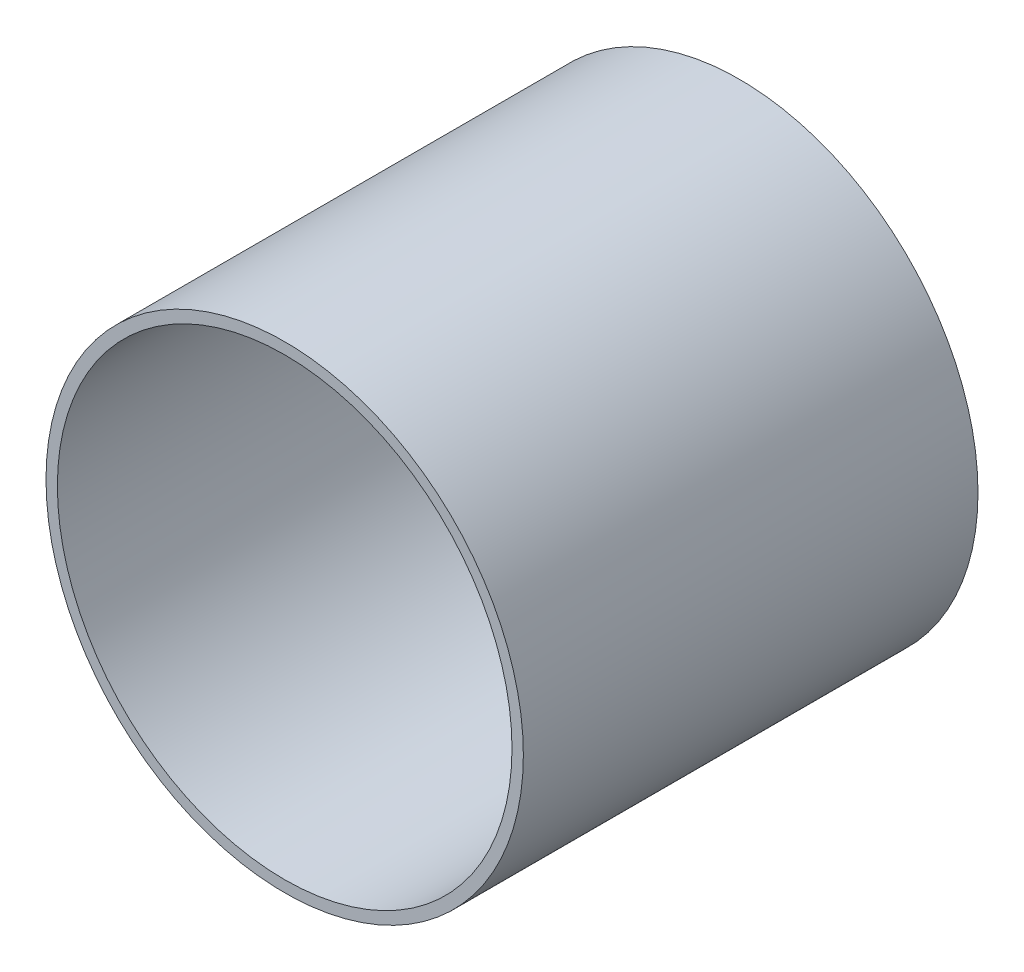
ISO-10303-21;
HEADER;
FILE_DESCRIPTION(('STEP AP214'),'2;1');
FILE_NAME('part.step','',(''),(''),'','','');
FILE_SCHEMA(('AUTOMOTIVE_DESIGN { 1 0 10303 214 1 1 1 1 }'));
ENDSEC;
DATA;
#1=APPLICATION_CONTEXT('core data for automotive mechanical design processes');
#2=APPLICATION_PROTOCOL_DEFINITION('international standard','automotive_design',2000,#1);
#3=PRODUCT_CONTEXT('',#1,'mechanical');
#4=PRODUCT('Part','Part','',(#3));
#5=PRODUCT_RELATED_PRODUCT_CATEGORY('part','',(#4));
#6=PRODUCT_DEFINITION_FORMATION('','',#4);
#7=PRODUCT_DEFINITION_CONTEXT('part definition',#1,'design');
#8=PRODUCT_DEFINITION('design','',#6,#7);
#9=PRODUCT_DEFINITION_SHAPE('','',#8);
#10=(LENGTH_UNIT() NAMED_UNIT(*) SI_UNIT(.MILLI.,.METRE.));
#11=(NAMED_UNIT(*) PLANE_ANGLE_UNIT() SI_UNIT($,.RADIAN.));
#12=(NAMED_UNIT(*) SI_UNIT($,.STERADIAN.) SOLID_ANGLE_UNIT());
#13=UNCERTAINTY_MEASURE_WITH_UNIT(LENGTH_MEASURE(1.E-05),#10,'distance_accuracy_value','');
#14=(GEOMETRIC_REPRESENTATION_CONTEXT(3) GLOBAL_UNCERTAINTY_ASSIGNED_CONTEXT((#13)) GLOBAL_UNIT_ASSIGNED_CONTEXT((#10,
#11,#12)) REPRESENTATION_CONTEXT('',''));
#15=CARTESIAN_POINT('',(0.,0.,0.));
#16=DIRECTION('',(0.,0.,1.));
#17=DIRECTION('',(1.,0.,0.));
#18=AXIS2_PLACEMENT_3D('',#15,#16,#17);
#19=CARTESIAN_POINT('',(0.,0.,40.));
#20=DIRECTION('',(0.,0.,1.));
#21=DIRECTION('',(1.,0.,0.));
#22=AXIS2_PLACEMENT_3D('',#19,#20,#21);
#23=PLANE('',#22);
#24=CARTESIAN_POINT('',(0.,0.,40.));
#25=DIRECTION('',(0.,0.,1.));
#26=DIRECTION('',(1.,0.,0.));
#27=AXIS2_PLACEMENT_3D('',#24,#25,#26);
#28=CIRCLE('',#27,21.);
#29=CARTESIAN_POINT('',(21.,0.,40.));
#30=VERTEX_POINT('',#29);
#31=EDGE_CURVE('E10',#30,#30,#28,.T.);
#32=ORIENTED_EDGE('',*,*,#31,.T.);
#33=EDGE_LOOP('',(#32));
#34=FACE_BOUND('',#33,.T.);
#35=CARTESIAN_POINT('',(0.,0.,40.));
#36=DIRECTION('',(0.,0.,1.));
#37=DIRECTION('',(1.,0.,0.));
#38=AXIS2_PLACEMENT_3D('',#35,#36,#37);
#39=CIRCLE('',#38,20.);
#40=CARTESIAN_POINT('',(20.,0.,40.));
#41=VERTEX_POINT('',#40);
#42=EDGE_CURVE('E52',#41,#41,#39,.T.);
#43=ORIENTED_EDGE('',*,*,#42,.F.);
#44=EDGE_LOOP('',(#43));
#45=FACE_BOUND('',#44,.T.);
#46=ADVANCED_FACE('F41',(#34,#45),#23,.T.);
#47=CARTESIAN_POINT('',(0.,0.,0.));
#48=DIRECTION('',(0.,0.,1.));
#49=DIRECTION('',(1.,0.,0.));
#50=AXIS2_PLACEMENT_3D('',#47,#48,#49);
#51=PLANE('',#50);
#52=CARTESIAN_POINT('',(0.,0.,0.));
#53=DIRECTION('',(0.,0.,1.));
#54=DIRECTION('',(1.,0.,0.));
#55=AXIS2_PLACEMENT_3D('',#52,#53,#54);
#56=CIRCLE('',#55,21.);
#57=CARTESIAN_POINT('',(21.,0.,0.));
#58=VERTEX_POINT('',#57);
#59=EDGE_CURVE('E45',#58,#58,#56,.T.);
#60=ORIENTED_EDGE('',*,*,#59,.F.);
#61=EDGE_LOOP('',(#60));
#62=FACE_BOUND('',#61,.T.);
#63=CARTESIAN_POINT('',(0.,0.,0.));
#64=DIRECTION('',(0.,0.,1.));
#65=DIRECTION('',(1.,0.,0.));
#66=AXIS2_PLACEMENT_3D('',#63,#64,#65);
#67=CIRCLE('',#66,20.);
#68=CARTESIAN_POINT('',(20.,0.,0.));
#69=VERTEX_POINT('',#68);
#70=EDGE_CURVE('E54',#69,#69,#67,.T.);
#71=ORIENTED_EDGE('',*,*,#70,.T.);
#72=EDGE_LOOP('',(#71));
#73=FACE_BOUND('',#72,.T.);
#74=ADVANCED_FACE('F64',(#62,#73),#51,.F.);
#75=CARTESIAN_POINT('',(0.,0.,40.));
#76=DIRECTION('',(0.,0.,-1.));
#77=DIRECTION('',(-1.,0.,0.));
#78=AXIS2_PLACEMENT_3D('',#75,#76,#77);
#79=CYLINDRICAL_SURFACE('',#78,21.);
#80=ORIENTED_EDGE('',*,*,#31,.F.);
#81=EDGE_LOOP('',(#80));
#82=FACE_BOUND('',#81,.T.);
#83=ORIENTED_EDGE('',*,*,#59,.T.);
#84=EDGE_LOOP('',(#83));
#85=FACE_BOUND('',#84,.T.);
#86=ADVANCED_FACE('F43',(#82,#85),#79,.T.);
#87=CARTESIAN_POINT('',(0.,0.,40.));
#88=DIRECTION('',(0.,0.,-1.));
#89=DIRECTION('',(-1.,0.,0.));
#90=AXIS2_PLACEMENT_3D('',#87,#88,#89);
#91=CYLINDRICAL_SURFACE('',#90,20.);
#92=ORIENTED_EDGE('',*,*,#42,.T.);
#93=EDGE_LOOP('',(#92));
#94=FACE_BOUND('',#93,.T.);
#95=ORIENTED_EDGE('',*,*,#70,.F.);
#96=EDGE_LOOP('',(#95));
#97=FACE_BOUND('',#96,.T.);
#98=ADVANCED_FACE('F60',(#94,#97),#91,.F.);
#99=CLOSED_SHELL('',(#46,#74,#86,#98));
#100=MANIFOLD_SOLID_BREP('B2',#99);
#101=ADVANCED_BREP_SHAPE_REPRESENTATION('',(#18,#100),#14);
#102=SHAPE_DEFINITION_REPRESENTATION(#9,#101);
ENDSEC;
END-ISO-10303-21;
